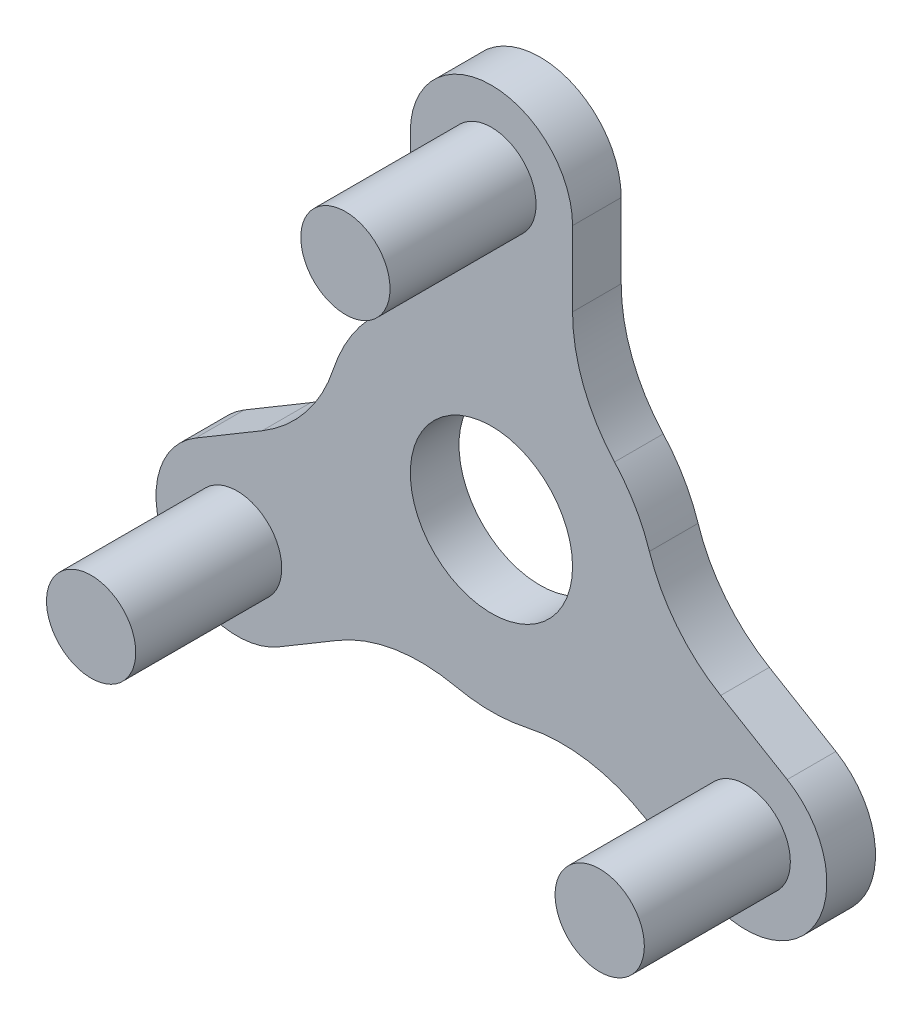
ISO-10303-21;
HEADER;
FILE_DESCRIPTION(('STEP AP214'),'2;1');
FILE_NAME('part.step','',(''),(''),'','','');
FILE_SCHEMA(('AUTOMOTIVE_DESIGN { 1 0 10303 214 1 1 1 1 }'));
ENDSEC;
DATA;
#1=APPLICATION_CONTEXT('core data for automotive mechanical design processes');
#2=APPLICATION_PROTOCOL_DEFINITION('international standard','automotive_design',2000,#1);
#3=PRODUCT_CONTEXT('',#1,'mechanical');
#4=PRODUCT('Part','Part','',(#3));
#5=PRODUCT_RELATED_PRODUCT_CATEGORY('part','',(#4));
#6=PRODUCT_DEFINITION_FORMATION('','',#4);
#7=PRODUCT_DEFINITION_CONTEXT('part definition',#1,'design');
#8=PRODUCT_DEFINITION('design','',#6,#7);
#9=PRODUCT_DEFINITION_SHAPE('','',#8);
#10=(LENGTH_UNIT() NAMED_UNIT(*) SI_UNIT(.MILLI.,.METRE.));
#11=(NAMED_UNIT(*) PLANE_ANGLE_UNIT() SI_UNIT($,.RADIAN.));
#12=(NAMED_UNIT(*) SI_UNIT($,.STERADIAN.) SOLID_ANGLE_UNIT());
#13=UNCERTAINTY_MEASURE_WITH_UNIT(LENGTH_MEASURE(1.E-05),#10,'distance_accuracy_value','');
#14=(GEOMETRIC_REPRESENTATION_CONTEXT(3) GLOBAL_UNCERTAINTY_ASSIGNED_CONTEXT((#13)) GLOBAL_UNIT_ASSIGNED_CONTEXT((#10,
#11,#12)) REPRESENTATION_CONTEXT('',''));
#15=CARTESIAN_POINT('',(0.,0.,0.));
#16=DIRECTION('',(0.,0.,1.));
#17=DIRECTION('',(1.,0.,0.));
#18=AXIS2_PLACEMENT_3D('',#15,#16,#17);
#19=CARTESIAN_POINT('',(-15.6750598084983,-9.05000000000008,3.));
#20=DIRECTION('',(0.,0.,-1.));
#21=DIRECTION('',(-1.,0.,0.));
#22=AXIS2_PLACEMENT_3D('',#19,#20,#21);
#23=CYLINDRICAL_SURFACE('',#22,5.);
#24=CARTESIAN_POINT('',(-15.6750598084983,-9.05000000000008,0.));
#25=DIRECTION('',(0.,0.,1.));
#26=DIRECTION('',(1.,0.,0.));
#27=AXIS2_PLACEMENT_3D('',#24,#25,#26);
#28=CIRCLE('',#27,5.);
#29=CARTESIAN_POINT('',(-18.2317713929619,-4.75311439832654,0.));
#30=VERTEX_POINT('',#29);
#31=CARTESIAN_POINT('',(-13.1183482240346,-13.3468856016736,0.));
#32=VERTEX_POINT('',#31);
#33=EDGE_CURVE('E254',#30,#32,#28,.T.);
#34=ORIENTED_EDGE('',*,*,#33,.T.);
#35=DIRECTION('',(0.,0.,-1.));
#36=VECTOR('',#35,1.);
#37=CARTESIAN_POINT('',(-13.1183482240346,-13.3468856016736,3.));
#38=LINE('',#37,#36);
#39=CARTESIAN_POINT('',(-13.1183482240346,-13.3468856016736,3.));
#40=VERTEX_POINT('',#39);
#41=EDGE_CURVE('E210',#40,#32,#38,.T.);
#42=ORIENTED_EDGE('',*,*,#41,.F.);
#43=CARTESIAN_POINT('',(-15.6750598084983,-9.05000000000008,3.));
#44=DIRECTION('',(0.,0.,1.));
#45=DIRECTION('',(1.,0.,0.));
#46=AXIS2_PLACEMENT_3D('',#43,#44,#45);
#47=CIRCLE('',#46,5.);
#48=CARTESIAN_POINT('',(-18.2317713929619,-4.75311439832654,3.));
#49=VERTEX_POINT('',#48);
#50=EDGE_CURVE('E213',#49,#40,#47,.T.);
#51=ORIENTED_EDGE('',*,*,#50,.F.);
#52=DIRECTION('',(0.,0.,-1.));
#53=VECTOR('',#52,1.);
#54=CARTESIAN_POINT('',(-18.2317713929619,-4.75311439832654,3.));
#55=LINE('',#54,#53);
#56=EDGE_CURVE('E198',#49,#30,#55,.T.);
#57=ORIENTED_EDGE('',*,*,#56,.T.);
#58=EDGE_LOOP('',(#34,#42,#51,#57));
#59=FACE_BOUND('',#58,.T.);
#60=ADVANCED_FACE('F73',(#59),#23,.T.);
#61=CARTESIAN_POINT('',(2.43503335375282,-4.09238954480285,3.));
#62=DIRECTION('',(-0.511342316892728,0.859377120334709,0.));
#63=DIRECTION('',(-0.859377120334709,-0.511342316892728,0.));
#64=AXIS2_PLACEMENT_3D('',#61,#62,#63);
#65=PLANE('',#64);
#66=DIRECTION('',(0.859377120334709,0.511342316892728,0.));
#67=VECTOR('',#66,1.);
#68=CARTESIAN_POINT('',(2.43503335375282,-4.09238954480285,0.));
#69=LINE('',#68,#67);
#70=CARTESIAN_POINT('',(-9.46922520496294,-11.1756025001734,0.));
#71=VERTEX_POINT('',#70);
#72=EDGE_CURVE('E257',#32,#71,#69,.T.);
#73=ORIENTED_EDGE('',*,*,#72,.T.);
#74=DIRECTION('',(0.,0.,1.));
#75=VECTOR('',#74,1.);
#76=CARTESIAN_POINT('',(-9.46922520496294,-11.1756025001734,3.));
#77=LINE('',#76,#75);
#78=CARTESIAN_POINT('',(-9.46922520496294,-11.1756025001734,3.));
#79=VERTEX_POINT('',#78);
#80=EDGE_CURVE('E88',#71,#79,#77,.T.);
#81=ORIENTED_EDGE('',*,*,#80,.T.);
#82=DIRECTION('',(0.859377120334709,0.511342316892728,0.));
#83=VECTOR('',#82,1.);
#84=CARTESIAN_POINT('',(2.43503335375282,-4.09238954480285,3.));
#85=LINE('',#84,#83);
#86=EDGE_CURVE('E216',#40,#79,#85,.T.);
#87=ORIENTED_EDGE('',*,*,#86,.F.);
#88=ORIENTED_EDGE('',*,*,#41,.T.);
#89=EDGE_LOOP('',(#73,#81,#87,#88));
#90=FACE_BOUND('',#89,.T.);
#91=ADVANCED_FACE('F352',(#90),#65,.F.);
#92=CARTESIAN_POINT('',(0.,0.,3.));
#93=DIRECTION('',(0.,0.,-1.));
#94=DIRECTION('',(-1.,0.,0.));
#95=AXIS2_PLACEMENT_3D('',#92,#93,#94);
#96=CYLINDRICAL_SURFACE('',#95,10.2435458358109);
#97=CARTESIAN_POINT('',(0.,0.,0.));
#98=DIRECTION('',(0.,0.,1.));
#99=DIRECTION('',(1.,0.,0.));
#100=AXIS2_PLACEMENT_3D('',#97,#98,#99);
#101=CIRCLE('',#100,10.2435458358109);
#102=CARTESIAN_POINT('',(-2.20410288640831,-10.0036074371442,0.));
#103=VERTEX_POINT('',#102);
#104=CARTESIAN_POINT('',(2.20410288640832,-10.0036074371442,0.));
#105=VERTEX_POINT('',#104);
#106=EDGE_CURVE('E228',#103,#105,#101,.T.);
#107=ORIENTED_EDGE('',*,*,#106,.T.);
#108=DIRECTION('',(0.,0.,-1.));
#109=VECTOR('',#108,1.);
#110=CARTESIAN_POINT('',(2.20410288640832,-10.0036074371442,3.));
#111=LINE('',#110,#109);
#112=CARTESIAN_POINT('',(2.20410288640832,-10.0036074371442,3.));
#113=VERTEX_POINT('',#112);
#114=EDGE_CURVE('E291',#105,#113,#111,.F.);
#115=ORIENTED_EDGE('',*,*,#114,.T.);
#116=CARTESIAN_POINT('',(0.,0.,3.));
#117=DIRECTION('',(0.,0.,1.));
#118=DIRECTION('',(1.,0.,0.));
#119=AXIS2_PLACEMENT_3D('',#116,#117,#118);
#120=CIRCLE('',#119,10.2435458358109);
#121=CARTESIAN_POINT('',(-2.20410288640831,-10.0036074371442,3.));
#122=VERTEX_POINT('',#121);
#123=EDGE_CURVE('E234',#122,#113,#120,.T.);
#124=ORIENTED_EDGE('',*,*,#123,.F.);
#125=DIRECTION('',(0.,0.,-1.));
#126=VECTOR('',#125,1.);
#127=CARTESIAN_POINT('',(-2.20410288640831,-10.0036074371442,3.));
#128=LINE('',#127,#126);
#129=EDGE_CURVE('E288',#122,#103,#128,.T.);
#130=ORIENTED_EDGE('',*,*,#129,.T.);
#131=EDGE_LOOP('',(#107,#115,#124,#130));
#132=FACE_BOUND('',#131,.T.);
#133=ADVANCED_FACE('F357',(#132),#96,.T.);
#134=CARTESIAN_POINT('',(-2.43503335375282,-4.09238954480286,3.));
#135=DIRECTION('',(-0.511342316892728,-0.859377120334709,0.));
#136=DIRECTION('',(0.859377120334709,-0.511342316892728,0.));
#137=AXIS2_PLACEMENT_3D('',#134,#135,#136);
#138=PLANE('',#137);
#139=DIRECTION('',(-0.859377120334709,0.511342316892728,0.));
#140=VECTOR('',#139,1.);
#141=CARTESIAN_POINT('',(-2.43503335375282,-4.09238954480286,3.));
#142=LINE('',#141,#140);
#143=CARTESIAN_POINT('',(13.1183482240346,-13.3468856016736,3.));
#144=VERTEX_POINT('',#143);
#145=CARTESIAN_POINT('',(9.46922520496294,-11.1756025001734,3.));
#146=VERTEX_POINT('',#145);
#147=EDGE_CURVE('E240',#144,#146,#142,.T.);
#148=ORIENTED_EDGE('',*,*,#147,.T.);
#149=DIRECTION('',(0.,0.,-1.));
#150=VECTOR('',#149,1.);
#151=CARTESIAN_POINT('',(9.46922520496294,-11.1756025001734,3.));
#152=LINE('',#151,#150);
#153=CARTESIAN_POINT('',(9.46922520496294,-11.1756025001734,0.));
#154=VERTEX_POINT('',#153);
#155=EDGE_CURVE('E209',#146,#154,#152,.T.);
#156=ORIENTED_EDGE('',*,*,#155,.T.);
#157=DIRECTION('',(-0.859377120334709,0.511342316892728,0.));
#158=VECTOR('',#157,1.);
#159=CARTESIAN_POINT('',(-2.43503335375282,-4.09238954480286,0.));
#160=LINE('',#159,#158);
#161=CARTESIAN_POINT('',(13.1183482240346,-13.3468856016736,0.));
#162=VERTEX_POINT('',#161);
#163=EDGE_CURVE('E259',#162,#154,#160,.T.);
#164=ORIENTED_EDGE('',*,*,#163,.F.);
#165=DIRECTION('',(0.,0.,-1.));
#166=VECTOR('',#165,1.);
#167=CARTESIAN_POINT('',(13.1183482240346,-13.3468856016736,3.));
#168=LINE('',#167,#166);
#169=EDGE_CURVE('E278',#144,#162,#168,.T.);
#170=ORIENTED_EDGE('',*,*,#169,.F.);
#171=EDGE_LOOP('',(#148,#156,#164,#170));
#172=FACE_BOUND('',#171,.T.);
#173=ADVANCED_FACE('F415',(#172),#138,.T.);
#174=CARTESIAN_POINT('',(2.67838981517445,4.50138165854423,3.));
#175=DIRECTION('',(-0.511342316892728,-0.859377120334709,0.));
#176=DIRECTION('',(0.859377120334709,-0.511342316892728,0.));
#177=AXIS2_PLACEMENT_3D('',#174,#175,#176);
#178=PLANE('',#177);
#179=DIRECTION('',(-0.859377120334709,0.511342316892728,0.));
#180=VECTOR('',#179,1.);
#181=CARTESIAN_POINT('',(2.67838981517445,4.50138165854423,0.));
#182=LINE('',#181,#180);
#183=CARTESIAN_POINT('',(18.2317713929619,-4.75311439832654,0.));
#184=VERTEX_POINT('',#183);
#185=CARTESIAN_POINT('',(14.1312068435024,-2.31321679380084,0.));
#186=VERTEX_POINT('',#185);
#187=EDGE_CURVE('E262',#184,#186,#182,.T.);
#188=ORIENTED_EDGE('',*,*,#187,.T.);
#189=DIRECTION('',(0.,0.,1.));
#190=VECTOR('',#189,1.);
#191=CARTESIAN_POINT('',(14.1312068435024,-2.31321679380084,3.));
#192=LINE('',#191,#190);
#193=CARTESIAN_POINT('',(14.1312068435024,-2.31321679380084,3.));
#194=VERTEX_POINT('',#193);
#195=EDGE_CURVE('E298',#186,#194,#192,.T.);
#196=ORIENTED_EDGE('',*,*,#195,.T.);
#197=DIRECTION('',(-0.859377120334709,0.511342316892728,0.));
#198=VECTOR('',#197,1.);
#199=CARTESIAN_POINT('',(2.67838981517445,4.50138165854423,3.));
#200=LINE('',#199,#198);
#201=CARTESIAN_POINT('',(18.2317713929619,-4.75311439832654,3.));
#202=VERTEX_POINT('',#201);
#203=EDGE_CURVE('E243',#202,#194,#200,.T.);
#204=ORIENTED_EDGE('',*,*,#203,.F.);
#205=DIRECTION('',(0.,0.,-1.));
#206=VECTOR('',#205,1.);
#207=CARTESIAN_POINT('',(18.2317713929619,-4.75311439832654,3.));
#208=LINE('',#207,#206);
#209=EDGE_CURVE('E276',#202,#184,#208,.T.);
#210=ORIENTED_EDGE('',*,*,#209,.T.);
#211=EDGE_LOOP('',(#188,#196,#204,#210));
#212=FACE_BOUND('',#211,.T.);
#213=ADVANCED_FACE('F413',(#212),#178,.F.);
#214=CARTESIAN_POINT('',(9.73807905119151,3.17805721834967,3.));
#215=VERTEX_POINT('',#214);
#216=CARTESIAN_POINT('',(7.59023092018547,6.87885352864995,3.));
#217=VERTEX_POINT('',#216);
#218=EDGE_CURVE('E239',#215,#217,#120,.T.);
#219=ORIENTED_EDGE('',*,*,#218,.F.);
#220=DIRECTION('',(0.,0.,-1.));
#221=VECTOR('',#220,1.);
#222=CARTESIAN_POINT('',(9.73807905119151,3.17805721834967,3.));
#223=LINE('',#222,#221);
#224=CARTESIAN_POINT('',(9.73807905119151,3.17805721834967,0.));
#225=VERTEX_POINT('',#224);
#226=EDGE_CURVE('E295',#215,#225,#223,.T.);
#227=ORIENTED_EDGE('',*,*,#226,.T.);
#228=CARTESIAN_POINT('',(7.59023092018547,6.87885352864995,0.));
#229=VERTEX_POINT('',#228);
#230=EDGE_CURVE('E227',#225,#229,#101,.T.);
#231=ORIENTED_EDGE('',*,*,#230,.T.);
#232=DIRECTION('',(0.,0.,-1.));
#233=VECTOR('',#232,1.);
#234=CARTESIAN_POINT('',(7.59023092018547,6.87885352864995,3.));
#235=LINE('',#234,#233);
#236=EDGE_CURVE('E293',#229,#217,#235,.F.);
#237=ORIENTED_EDGE('',*,*,#236,.T.);
#238=EDGE_LOOP('',(#219,#227,#231,#237));
#239=FACE_BOUND('',#238,.T.);
#240=ADVANCED_FACE('F407',(#239),#96,.T.);
#241=CARTESIAN_POINT('',(5.,0.,3.));
#242=DIRECTION('',(1.,0.,0.));
#243=DIRECTION('',(0.,1.,0.));
#244=AXIS2_PLACEMENT_3D('',#241,#242,#243);
#245=PLANE('',#244);
#246=DIRECTION('',(0.,-1.,0.));
#247=VECTOR('',#246,1.);
#248=CARTESIAN_POINT('',(5.,0.,3.));
#249=LINE('',#248,#247);
#250=CARTESIAN_POINT('',(5.,18.2,3.));
#251=VERTEX_POINT('',#250);
#252=CARTESIAN_POINT('',(5.,13.5941585986989,3.));
#253=VERTEX_POINT('',#252);
#254=EDGE_CURVE('E246',#251,#253,#249,.T.);
#255=ORIENTED_EDGE('',*,*,#254,.T.);
#256=DIRECTION('',(0.,0.,-1.));
#257=VECTOR('',#256,1.);
#258=CARTESIAN_POINT('',(5.,13.5941585986989,3.));
#259=LINE('',#258,#257);
#260=CARTESIAN_POINT('',(5.,13.5941585986989,0.));
#261=VERTEX_POINT('',#260);
#262=EDGE_CURVE('E300',#253,#261,#259,.T.);
#263=ORIENTED_EDGE('',*,*,#262,.T.);
#264=DIRECTION('',(0.,-1.,0.));
#265=VECTOR('',#264,1.);
#266=CARTESIAN_POINT('',(5.,0.,0.));
#267=LINE('',#266,#265);
#268=CARTESIAN_POINT('',(5.,18.2,0.));
#269=VERTEX_POINT('',#268);
#270=EDGE_CURVE('E265',#269,#261,#267,.T.);
#271=ORIENTED_EDGE('',*,*,#270,.F.);
#272=DIRECTION('',(0.,0.,-1.));
#273=VECTOR('',#272,1.);
#274=CARTESIAN_POINT('',(5.,18.2,3.));
#275=LINE('',#274,#273);
#276=EDGE_CURVE('E274',#251,#269,#275,.T.);
#277=ORIENTED_EDGE('',*,*,#276,.F.);
#278=EDGE_LOOP('',(#255,#263,#271,#277));
#279=FACE_BOUND('',#278,.T.);
#280=ADVANCED_FACE('F387',(#279),#245,.T.);
#281=CARTESIAN_POINT('',(0.,18.2,3.));
#282=DIRECTION('',(0.,0.,-1.));
#283=DIRECTION('',(-1.,0.,0.));
#284=AXIS2_PLACEMENT_3D('',#281,#282,#283);
#285=CYLINDRICAL_SURFACE('',#284,5.);
#286=CARTESIAN_POINT('',(0.,18.2,0.));
#287=DIRECTION('',(0.,0.,1.));
#288=DIRECTION('',(1.,0.,0.));
#289=AXIS2_PLACEMENT_3D('',#286,#287,#288);
#290=CIRCLE('',#289,5.);
#291=CARTESIAN_POINT('',(-5.,18.2,0.));
#292=VERTEX_POINT('',#291);
#293=EDGE_CURVE('E268',#269,#292,#290,.T.);
#294=ORIENTED_EDGE('',*,*,#293,.T.);
#295=DIRECTION('',(0.,0.,-1.));
#296=VECTOR('',#295,1.);
#297=CARTESIAN_POINT('',(-5.,18.2,3.));
#298=LINE('',#297,#296);
#299=CARTESIAN_POINT('',(-5.,18.2,3.));
#300=VERTEX_POINT('',#299);
#301=EDGE_CURVE('E237',#300,#292,#298,.T.);
#302=ORIENTED_EDGE('',*,*,#301,.F.);
#303=CARTESIAN_POINT('',(0.,18.2,3.));
#304=DIRECTION('',(0.,0.,1.));
#305=DIRECTION('',(1.,0.,0.));
#306=AXIS2_PLACEMENT_3D('',#303,#304,#305);
#307=CIRCLE('',#306,5.);
#308=EDGE_CURVE('E249',#251,#300,#307,.T.);
#309=ORIENTED_EDGE('',*,*,#308,.F.);
#310=ORIENTED_EDGE('',*,*,#276,.T.);
#311=EDGE_LOOP('',(#294,#302,#309,#310));
#312=FACE_BOUND('',#311,.T.);
#313=ADVANCED_FACE('F393',(#312),#285,.T.);
#314=CARTESIAN_POINT('',(-5.,0.,3.));
#315=DIRECTION('',(1.,0.,0.));
#316=DIRECTION('',(0.,1.,0.));
#317=AXIS2_PLACEMENT_3D('',#314,#315,#316);
#318=PLANE('',#317);
#319=DIRECTION('',(0.,-1.,0.));
#320=VECTOR('',#319,1.);
#321=CARTESIAN_POINT('',(-5.,0.,0.));
#322=LINE('',#321,#320);
#323=CARTESIAN_POINT('',(-5.,13.5941585986989,0.));
#324=VERTEX_POINT('',#323);
#325=EDGE_CURVE('E225',#292,#324,#322,.T.);
#326=ORIENTED_EDGE('',*,*,#325,.T.);
#327=DIRECTION('',(0.,0.,1.));
#328=VECTOR('',#327,1.);
#329=CARTESIAN_POINT('',(-5.,13.5941585986989,3.));
#330=LINE('',#329,#328);
#331=CARTESIAN_POINT('',(-5.,13.5941585986989,3.));
#332=VERTEX_POINT('',#331);
#333=EDGE_CURVE('E308',#324,#332,#330,.T.);
#334=ORIENTED_EDGE('',*,*,#333,.T.);
#335=DIRECTION('',(0.,-1.,0.));
#336=VECTOR('',#335,1.);
#337=CARTESIAN_POINT('',(-5.,0.,3.));
#338=LINE('',#337,#336);
#339=EDGE_CURVE('E238',#300,#332,#338,.T.);
#340=ORIENTED_EDGE('',*,*,#339,.F.);
#341=ORIENTED_EDGE('',*,*,#301,.T.);
#342=EDGE_LOOP('',(#326,#334,#340,#341));
#343=FACE_BOUND('',#342,.T.);
#344=ADVANCED_FACE('F399',(#343),#318,.F.);
#345=CARTESIAN_POINT('',(-7.59023092018547,6.87885352864995,3.));
#346=VERTEX_POINT('',#345);
#347=CARTESIAN_POINT('',(-9.73807905119151,3.17805721834968,3.));
#348=VERTEX_POINT('',#347);
#349=EDGE_CURVE('E235',#346,#348,#120,.T.);
#350=ORIENTED_EDGE('',*,*,#349,.F.);
#351=DIRECTION('',(0.,0.,-1.));
#352=VECTOR('',#351,1.);
#353=CARTESIAN_POINT('',(-7.59023092018547,6.87885352864995,3.));
#354=LINE('',#353,#352);
#355=CARTESIAN_POINT('',(-7.59023092018547,6.87885352864995,0.));
#356=VERTEX_POINT('',#355);
#357=EDGE_CURVE('E305',#346,#356,#354,.T.);
#358=ORIENTED_EDGE('',*,*,#357,.T.);
#359=CARTESIAN_POINT('',(-9.73807905119151,3.17805721834968,0.));
#360=VERTEX_POINT('',#359);
#361=EDGE_CURVE('E222',#356,#360,#101,.T.);
#362=ORIENTED_EDGE('',*,*,#361,.T.);
#363=DIRECTION('',(0.,0.,-1.));
#364=VECTOR('',#363,1.);
#365=CARTESIAN_POINT('',(-9.73807905119151,3.17805721834968,3.));
#366=LINE('',#365,#364);
#367=EDGE_CURVE('E303',#360,#348,#366,.F.);
#368=ORIENTED_EDGE('',*,*,#367,.T.);
#369=EDGE_LOOP('',(#350,#358,#362,#368));
#370=FACE_BOUND('',#369,.T.);
#371=ADVANCED_FACE('F337',(#370),#96,.T.);
#372=CARTESIAN_POINT('',(-2.67838981517446,4.50138165854424,3.));
#373=DIRECTION('',(-0.511342316892728,0.859377120334709,0.));
#374=DIRECTION('',(-0.859377120334709,-0.511342316892728,0.));
#375=AXIS2_PLACEMENT_3D('',#372,#373,#374);
#376=PLANE('',#375);
#377=DIRECTION('',(0.859377120334709,0.511342316892728,0.));
#378=VECTOR('',#377,1.);
#379=CARTESIAN_POINT('',(-2.67838981517446,4.50138165854424,3.));
#380=LINE('',#379,#378);
#381=CARTESIAN_POINT('',(-14.1312068435023,-2.31321679380083,3.));
#382=VERTEX_POINT('',#381);
#383=EDGE_CURVE('E203',#49,#382,#380,.T.);
#384=ORIENTED_EDGE('',*,*,#383,.T.);
#385=DIRECTION('',(0.,0.,-1.));
#386=VECTOR('',#385,1.);
#387=CARTESIAN_POINT('',(-14.1312068435023,-2.31321679380083,3.));
#388=LINE('',#387,#386);
#389=CARTESIAN_POINT('',(-14.1312068435023,-2.31321679380083,0.));
#390=VERTEX_POINT('',#389);
#391=EDGE_CURVE('E310',#382,#390,#388,.T.);
#392=ORIENTED_EDGE('',*,*,#391,.T.);
#393=DIRECTION('',(0.859377120334709,0.511342316892728,0.));
#394=VECTOR('',#393,1.);
#395=CARTESIAN_POINT('',(-2.67838981517446,4.50138165854424,0.));
#396=LINE('',#395,#394);
#397=EDGE_CURVE('E206',#30,#390,#396,.T.);
#398=ORIENTED_EDGE('',*,*,#397,.F.);
#399=ORIENTED_EDGE('',*,*,#56,.F.);
#400=EDGE_LOOP('',(#384,#392,#398,#399));
#401=FACE_BOUND('',#400,.T.);
#402=ADVANCED_FACE('F200',(#401),#376,.T.);
#403=CARTESIAN_POINT('',(0.,0.,0.));
#404=DIRECTION('',(0.,0.,1.));
#405=DIRECTION('',(1.,0.,0.));
#406=AXIS2_PLACEMENT_3D('',#403,#404,#405);
#407=PLANE('',#406);
#408=CARTESIAN_POINT('',(0.,0.,0.));
#409=DIRECTION('',(0.,0.,1.));
#410=DIRECTION('',(1.,0.,0.));
#411=AXIS2_PLACEMENT_3D('',#408,#409,#410);
#412=CIRCLE('',#411,5.);
#413=CARTESIAN_POINT('',(5.,0.,0.));
#414=VERTEX_POINT('',#413);
#415=EDGE_CURVE('E230',#414,#414,#412,.T.);
#416=ORIENTED_EDGE('',*,*,#415,.T.);
#417=EDGE_LOOP('',(#416));
#418=FACE_BOUND('',#417,.T.);
#419=ORIENTED_EDGE('',*,*,#397,.T.);
#420=CARTESIAN_POINT('',(-19.2446300124296,6.28055440954626,0.));
#421=DIRECTION('',(0.,0.,1.));
#422=DIRECTION('',(1.,0.,0.));
#423=AXIS2_PLACEMENT_3D('',#420,#421,#422);
#424=CIRCLE('',#423,10.);
#425=EDGE_CURVE('E329',#390,#360,#424,.T.);
#426=ORIENTED_EDGE('',*,*,#425,.T.);
#427=ORIENTED_EDGE('',*,*,#361,.F.);
#428=CARTESIAN_POINT('',(-15.,13.5941585986989,0.));
#429=DIRECTION('',(0.,0.,1.));
#430=DIRECTION('',(1.,0.,0.));
#431=AXIS2_PLACEMENT_3D('',#428,#429,#430);
#432=CIRCLE('',#431,10.);
#433=EDGE_CURVE('E325',#356,#324,#432,.T.);
#434=ORIENTED_EDGE('',*,*,#433,.T.);
#435=ORIENTED_EDGE('',*,*,#325,.F.);
#436=ORIENTED_EDGE('',*,*,#293,.F.);
#437=ORIENTED_EDGE('',*,*,#270,.T.);
#438=CARTESIAN_POINT('',(15.,13.5941585986989,0.));
#439=DIRECTION('',(0.,0.,1.));
#440=DIRECTION('',(1.,0.,0.));
#441=AXIS2_PLACEMENT_3D('',#438,#439,#440);
#442=CIRCLE('',#441,10.);
#443=EDGE_CURVE('E321',#261,#229,#442,.T.);
#444=ORIENTED_EDGE('',*,*,#443,.T.);
#445=ORIENTED_EDGE('',*,*,#230,.F.);
#446=CARTESIAN_POINT('',(19.2446300124296,6.28055440954625,0.));
#447=DIRECTION('',(0.,0.,1.));
#448=DIRECTION('',(1.,0.,0.));
#449=AXIS2_PLACEMENT_3D('',#446,#447,#448);
#450=CIRCLE('',#449,10.);
#451=EDGE_CURVE('E317',#225,#186,#450,.T.);
#452=ORIENTED_EDGE('',*,*,#451,.T.);
#453=ORIENTED_EDGE('',*,*,#187,.F.);
#454=CARTESIAN_POINT('',(15.6750598084983,-9.05000000000008,0.));
#455=DIRECTION('',(0.,0.,1.));
#456=DIRECTION('',(1.,0.,0.));
#457=AXIS2_PLACEMENT_3D('',#454,#455,#456);
#458=CIRCLE('',#457,5.);
#459=EDGE_CURVE('E283',#162,#184,#458,.T.);
#460=ORIENTED_EDGE('',*,*,#459,.F.);
#461=ORIENTED_EDGE('',*,*,#163,.T.);
#462=CARTESIAN_POINT('',(4.35580203603567,-19.7693737035204,0.));
#463=DIRECTION('',(0.,0.,1.));
#464=DIRECTION('',(1.,0.,0.));
#465=AXIS2_PLACEMENT_3D('',#462,#463,#464);
#466=CIRCLE('',#465,10.);
#467=EDGE_CURVE('E313',#154,#105,#466,.T.);
#468=ORIENTED_EDGE('',*,*,#467,.T.);
#469=ORIENTED_EDGE('',*,*,#106,.F.);
#470=CARTESIAN_POINT('',(-4.35580203603566,-19.7693737035204,0.));
#471=DIRECTION('',(0.,0.,1.));
#472=DIRECTION('',(1.,0.,0.));
#473=AXIS2_PLACEMENT_3D('',#470,#471,#472);
#474=CIRCLE('',#473,10.);
#475=EDGE_CURVE('E81',#103,#71,#474,.T.);
#476=ORIENTED_EDGE('',*,*,#475,.T.);
#477=ORIENTED_EDGE('',*,*,#72,.F.);
#478=ORIENTED_EDGE('',*,*,#33,.F.);
#479=EDGE_LOOP('',(#419,#426,#427,#434,#435,#436,#437,#444,#445,#452,#453,#460,#461,#468,#469,
#476,#477,#478));
#480=FACE_BOUND('',#479,.T.);
#481=ADVANCED_FACE('F332',(#418,#480),#407,.F.);
#482=CARTESIAN_POINT('',(0.,0.,3.));
#483=DIRECTION('',(0.,0.,1.));
#484=DIRECTION('',(1.,0.,0.));
#485=AXIS2_PLACEMENT_3D('',#482,#483,#484);
#486=PLANE('',#485);
#487=CARTESIAN_POINT('',(-15.6750598084983,-9.05000000000008,3.));
#488=DIRECTION('',(0.,0.,1.));
#489=DIRECTION('',(1.,0.,0.));
#490=AXIS2_PLACEMENT_3D('',#487,#488,#489);
#491=CIRCLE('',#490,2.75);
#492=CARTESIAN_POINT('',(-12.9250598084983,-9.05000000000008,3.));
#493=VERTEX_POINT('',#492);
#494=EDGE_CURVE('E628',#493,#493,#491,.T.);
#495=ORIENTED_EDGE('',*,*,#494,.F.);
#496=EDGE_LOOP('',(#495));
#497=FACE_BOUND('',#496,.T.);
#498=CARTESIAN_POINT('',(15.6750598084983,-9.05000000000008,3.));
#499=DIRECTION('',(0.,0.,1.));
#500=DIRECTION('',(1.,0.,0.));
#501=AXIS2_PLACEMENT_3D('',#498,#499,#500);
#502=CIRCLE('',#501,2.75);
#503=CARTESIAN_POINT('',(18.4250598084983,-9.05000000000008,3.));
#504=VERTEX_POINT('',#503);
#505=EDGE_CURVE('E622',#504,#504,#502,.T.);
#506=ORIENTED_EDGE('',*,*,#505,.F.);
#507=EDGE_LOOP('',(#506));
#508=FACE_BOUND('',#507,.T.);
#509=CARTESIAN_POINT('',(0.,18.2,3.));
#510=DIRECTION('',(0.,0.,1.));
#511=DIRECTION('',(1.,0.,0.));
#512=AXIS2_PLACEMENT_3D('',#509,#510,#511);
#513=CIRCLE('',#512,2.75);
#514=CARTESIAN_POINT('',(2.75,18.2,3.));
#515=VERTEX_POINT('',#514);
#516=EDGE_CURVE('E616',#515,#515,#513,.T.);
#517=ORIENTED_EDGE('',*,*,#516,.F.);
#518=EDGE_LOOP('',(#517));
#519=FACE_BOUND('',#518,.T.);
#520=CARTESIAN_POINT('',(0.,0.,3.));
#521=DIRECTION('',(0.,0.,1.));
#522=DIRECTION('',(1.,0.,0.));
#523=AXIS2_PLACEMENT_3D('',#520,#521,#522);
#524=CIRCLE('',#523,5.);
#525=CARTESIAN_POINT('',(5.,0.,3.));
#526=VERTEX_POINT('',#525);
#527=EDGE_CURVE('E611',#526,#526,#524,.T.);
#528=ORIENTED_EDGE('',*,*,#527,.F.);
#529=EDGE_LOOP('',(#528));
#530=FACE_BOUND('',#529,.T.);
#531=ORIENTED_EDGE('',*,*,#383,.F.);
#532=ORIENTED_EDGE('',*,*,#50,.T.);
#533=ORIENTED_EDGE('',*,*,#86,.T.);
#534=CARTESIAN_POINT('',(-4.35580203603566,-19.7693737035204,3.));
#535=DIRECTION('',(0.,0.,1.));
#536=DIRECTION('',(1.,0.,0.));
#537=AXIS2_PLACEMENT_3D('',#534,#535,#536);
#538=CIRCLE('',#537,10.);
#539=EDGE_CURVE('E12',#79,#122,#538,.F.);
#540=ORIENTED_EDGE('',*,*,#539,.T.);
#541=ORIENTED_EDGE('',*,*,#123,.T.);
#542=CARTESIAN_POINT('',(4.35580203603567,-19.7693737035204,3.));
#543=DIRECTION('',(0.,0.,1.));
#544=DIRECTION('',(1.,0.,0.));
#545=AXIS2_PLACEMENT_3D('',#542,#543,#544);
#546=CIRCLE('',#545,10.);
#547=EDGE_CURVE('E315',#113,#146,#546,.F.);
#548=ORIENTED_EDGE('',*,*,#547,.T.);
#549=ORIENTED_EDGE('',*,*,#147,.F.);
#550=CARTESIAN_POINT('',(15.6750598084983,-9.05000000000008,3.));
#551=DIRECTION('',(0.,0.,1.));
#552=DIRECTION('',(1.,0.,0.));
#553=AXIS2_PLACEMENT_3D('',#550,#551,#552);
#554=CIRCLE('',#553,5.);
#555=EDGE_CURVE('E255',#144,#202,#554,.T.);
#556=ORIENTED_EDGE('',*,*,#555,.T.);
#557=ORIENTED_EDGE('',*,*,#203,.T.);
#558=CARTESIAN_POINT('',(19.2446300124296,6.28055440954625,3.));
#559=DIRECTION('',(0.,0.,1.));
#560=DIRECTION('',(1.,0.,0.));
#561=AXIS2_PLACEMENT_3D('',#558,#559,#560);
#562=CIRCLE('',#561,10.);
#563=EDGE_CURVE('E319',#194,#215,#562,.F.);
#564=ORIENTED_EDGE('',*,*,#563,.T.);
#565=ORIENTED_EDGE('',*,*,#218,.T.);
#566=CARTESIAN_POINT('',(15.,13.5941585986989,3.));
#567=DIRECTION('',(0.,0.,1.));
#568=DIRECTION('',(1.,0.,0.));
#569=AXIS2_PLACEMENT_3D('',#566,#567,#568);
#570=CIRCLE('',#569,10.);
#571=EDGE_CURVE('E323',#217,#253,#570,.F.);
#572=ORIENTED_EDGE('',*,*,#571,.T.);
#573=ORIENTED_EDGE('',*,*,#254,.F.);
#574=ORIENTED_EDGE('',*,*,#308,.T.);
#575=ORIENTED_EDGE('',*,*,#339,.T.);
#576=CARTESIAN_POINT('',(-15.,13.5941585986989,3.));
#577=DIRECTION('',(0.,0.,1.));
#578=DIRECTION('',(1.,0.,0.));
#579=AXIS2_PLACEMENT_3D('',#576,#577,#578);
#580=CIRCLE('',#579,10.);
#581=EDGE_CURVE('E327',#332,#346,#580,.F.);
#582=ORIENTED_EDGE('',*,*,#581,.T.);
#583=ORIENTED_EDGE('',*,*,#349,.T.);
#584=CARTESIAN_POINT('',(-19.2446300124296,6.28055440954626,3.));
#585=DIRECTION('',(0.,0.,1.));
#586=DIRECTION('',(1.,0.,0.));
#587=AXIS2_PLACEMENT_3D('',#584,#585,#586);
#588=CIRCLE('',#587,10.);
#589=EDGE_CURVE('E221',#348,#382,#588,.F.);
#590=ORIENTED_EDGE('',*,*,#589,.T.);
#591=EDGE_LOOP('',(#531,#532,#533,#540,#541,#548,#549,#556,#557,#564,#565,#572,#573,#574,#575,
#582,#583,#590));
#592=FACE_BOUND('',#591,.T.);
#593=ADVANCED_FACE('F218',(#497,#508,#519,#530,#592),#486,.T.);
#594=CARTESIAN_POINT('',(15.6750598084983,-9.05000000000008,3.));
#595=DIRECTION('',(0.,0.,-1.));
#596=DIRECTION('',(-1.,0.,0.));
#597=AXIS2_PLACEMENT_3D('',#594,#595,#596);
#598=CYLINDRICAL_SURFACE('',#597,5.);
#599=ORIENTED_EDGE('',*,*,#169,.T.);
#600=ORIENTED_EDGE('',*,*,#459,.T.);
#601=ORIENTED_EDGE('',*,*,#209,.F.);
#602=ORIENTED_EDGE('',*,*,#555,.F.);
#603=EDGE_LOOP('',(#599,#600,#601,#602));
#604=FACE_BOUND('',#603,.T.);
#605=ADVANCED_FACE('F363',(#604),#598,.T.);
#606=CARTESIAN_POINT('',(0.,0.,-7.));
#607=DIRECTION('',(0.,0.,1.));
#608=DIRECTION('',(1.,0.,0.));
#609=AXIS2_PLACEMENT_3D('',#606,#607,#608);
#610=CYLINDRICAL_SURFACE('',#609,5.);
#611=ORIENTED_EDGE('',*,*,#527,.T.);
#612=EDGE_LOOP('',(#611));
#613=FACE_BOUND('',#612,.T.);
#614=ORIENTED_EDGE('',*,*,#415,.F.);
#615=EDGE_LOOP('',(#614));
#616=FACE_BOUND('',#615,.T.);
#617=ADVANCED_FACE('F366',(#613,#616),#610,.F.);
#618=CARTESIAN_POINT('',(4.35580203603567,-19.7693737035204,3.));
#619=DIRECTION('',(0.,0.,-1.));
#620=DIRECTION('',(-1.,0.,0.));
#621=AXIS2_PLACEMENT_3D('',#618,#619,#620);
#622=CYLINDRICAL_SURFACE('',#621,10.);
#623=ORIENTED_EDGE('',*,*,#547,.F.);
#624=ORIENTED_EDGE('',*,*,#114,.F.);
#625=ORIENTED_EDGE('',*,*,#467,.F.);
#626=ORIENTED_EDGE('',*,*,#155,.F.);
#627=EDGE_LOOP('',(#623,#624,#625,#626));
#628=FACE_BOUND('',#627,.T.);
#629=ADVANCED_FACE('F368',(#628),#622,.F.);
#630=CARTESIAN_POINT('',(19.2446300124296,6.28055440954625,3.));
#631=DIRECTION('',(0.,0.,-1.));
#632=DIRECTION('',(-1.,0.,0.));
#633=AXIS2_PLACEMENT_3D('',#630,#631,#632);
#634=CYLINDRICAL_SURFACE('',#633,10.);
#635=ORIENTED_EDGE('',*,*,#563,.F.);
#636=ORIENTED_EDGE('',*,*,#195,.F.);
#637=ORIENTED_EDGE('',*,*,#451,.F.);
#638=ORIENTED_EDGE('',*,*,#226,.F.);
#639=EDGE_LOOP('',(#635,#636,#637,#638));
#640=FACE_BOUND('',#639,.T.);
#641=ADVANCED_FACE('F371',(#640),#634,.F.);
#642=CARTESIAN_POINT('',(15.,13.5941585986989,3.));
#643=DIRECTION('',(0.,0.,-1.));
#644=DIRECTION('',(-1.,0.,0.));
#645=AXIS2_PLACEMENT_3D('',#642,#643,#644);
#646=CYLINDRICAL_SURFACE('',#645,10.);
#647=ORIENTED_EDGE('',*,*,#571,.F.);
#648=ORIENTED_EDGE('',*,*,#236,.F.);
#649=ORIENTED_EDGE('',*,*,#443,.F.);
#650=ORIENTED_EDGE('',*,*,#262,.F.);
#651=EDGE_LOOP('',(#647,#648,#649,#650));
#652=FACE_BOUND('',#651,.T.);
#653=ADVANCED_FACE('F348',(#652),#646,.F.);
#654=CARTESIAN_POINT('',(-15.,13.5941585986989,3.));
#655=DIRECTION('',(0.,0.,-1.));
#656=DIRECTION('',(-1.,0.,0.));
#657=AXIS2_PLACEMENT_3D('',#654,#655,#656);
#658=CYLINDRICAL_SURFACE('',#657,10.);
#659=ORIENTED_EDGE('',*,*,#581,.F.);
#660=ORIENTED_EDGE('',*,*,#333,.F.);
#661=ORIENTED_EDGE('',*,*,#433,.F.);
#662=ORIENTED_EDGE('',*,*,#357,.F.);
#663=EDGE_LOOP('',(#659,#660,#661,#662));
#664=FACE_BOUND('',#663,.T.);
#665=ADVANCED_FACE('F341',(#664),#658,.F.);
#666=CARTESIAN_POINT('',(-19.2446300124296,6.28055440954626,3.));
#667=DIRECTION('',(0.,0.,-1.));
#668=DIRECTION('',(-1.,0.,0.));
#669=AXIS2_PLACEMENT_3D('',#666,#667,#668);
#670=CYLINDRICAL_SURFACE('',#669,10.);
#671=ORIENTED_EDGE('',*,*,#589,.F.);
#672=ORIENTED_EDGE('',*,*,#367,.F.);
#673=ORIENTED_EDGE('',*,*,#425,.F.);
#674=ORIENTED_EDGE('',*,*,#391,.F.);
#675=EDGE_LOOP('',(#671,#672,#673,#674));
#676=FACE_BOUND('',#675,.T.);
#677=ADVANCED_FACE('F339',(#676),#670,.F.);
#678=CARTESIAN_POINT('',(-4.35580203603566,-19.7693737035204,3.));
#679=DIRECTION('',(0.,0.,-1.));
#680=DIRECTION('',(-1.,0.,0.));
#681=AXIS2_PLACEMENT_3D('',#678,#679,#680);
#682=CYLINDRICAL_SURFACE('',#681,10.);
#683=ORIENTED_EDGE('',*,*,#539,.F.);
#684=ORIENTED_EDGE('',*,*,#80,.F.);
#685=ORIENTED_EDGE('',*,*,#475,.F.);
#686=ORIENTED_EDGE('',*,*,#129,.F.);
#687=EDGE_LOOP('',(#683,#684,#685,#686));
#688=FACE_BOUND('',#687,.T.);
#689=ADVANCED_FACE('F75',(#688),#682,.F.);
#690=CARTESIAN_POINT('',(0.,18.2,12.));
#691=DIRECTION('',(0.,0.,-1.));
#692=DIRECTION('',(-1.,0.,0.));
#693=AXIS2_PLACEMENT_3D('',#690,#691,#692);
#694=CYLINDRICAL_SURFACE('',#693,2.75);
#695=CARTESIAN_POINT('',(0.,18.2,12.));
#696=DIRECTION('',(0.,0.,1.));
#697=DIRECTION('',(1.,0.,0.));
#698=AXIS2_PLACEMENT_3D('',#695,#696,#697);
#699=CIRCLE('',#698,2.75);
#700=CARTESIAN_POINT('',(2.75,18.2,12.));
#701=VERTEX_POINT('',#700);
#702=EDGE_CURVE('E613',#701,#701,#699,.T.);
#703=ORIENTED_EDGE('',*,*,#702,.F.);
#704=EDGE_LOOP('',(#703));
#705=FACE_BOUND('',#704,.T.);
#706=ORIENTED_EDGE('',*,*,#516,.T.);
#707=EDGE_LOOP('',(#706));
#708=FACE_BOUND('',#707,.T.);
#709=ADVANCED_FACE('F346',(#705,#708),#694,.T.);
#710=CARTESIAN_POINT('',(0.,18.2,12.));
#711=DIRECTION('',(0.,0.,1.));
#712=DIRECTION('',(1.,0.,0.));
#713=AXIS2_PLACEMENT_3D('',#710,#711,#712);
#714=PLANE('',#713);
#715=ORIENTED_EDGE('',*,*,#702,.T.);
#716=EDGE_LOOP('',(#715));
#717=FACE_BOUND('',#716,.T.);
#718=ADVANCED_FACE('F551',(#717),#714,.T.);
#719=CARTESIAN_POINT('',(15.6750598084983,-9.05000000000008,12.));
#720=DIRECTION('',(0.,0.,-1.));
#721=DIRECTION('',(-1.,0.,0.));
#722=AXIS2_PLACEMENT_3D('',#719,#720,#721);
#723=CYLINDRICAL_SURFACE('',#722,2.75);
#724=CARTESIAN_POINT('',(15.6750598084983,-9.05000000000008,12.));
#725=DIRECTION('',(0.,0.,1.));
#726=DIRECTION('',(1.,0.,0.));
#727=AXIS2_PLACEMENT_3D('',#724,#725,#726);
#728=CIRCLE('',#727,2.75);
#729=CARTESIAN_POINT('',(18.4250598084983,-9.05000000000008,12.));
#730=VERTEX_POINT('',#729);
#731=EDGE_CURVE('E620',#730,#730,#728,.T.);
#732=ORIENTED_EDGE('',*,*,#731,.F.);
#733=EDGE_LOOP('',(#732));
#734=FACE_BOUND('',#733,.T.);
#735=ORIENTED_EDGE('',*,*,#505,.T.);
#736=EDGE_LOOP('',(#735));
#737=FACE_BOUND('',#736,.T.);
#738=ADVANCED_FACE('F561',(#734,#737),#723,.T.);
#739=CARTESIAN_POINT('',(15.6750598084983,-9.05000000000008,12.));
#740=DIRECTION('',(0.,0.,1.));
#741=DIRECTION('',(1.,0.,0.));
#742=AXIS2_PLACEMENT_3D('',#739,#740,#741);
#743=PLANE('',#742);
#744=ORIENTED_EDGE('',*,*,#731,.T.);
#745=EDGE_LOOP('',(#744));
#746=FACE_BOUND('',#745,.T.);
#747=ADVANCED_FACE('F571',(#746),#743,.T.);
#748=CARTESIAN_POINT('',(-15.6750598084983,-9.05000000000008,12.));
#749=DIRECTION('',(0.,0.,-1.));
#750=DIRECTION('',(-1.,0.,0.));
#751=AXIS2_PLACEMENT_3D('',#748,#749,#750);
#752=CYLINDRICAL_SURFACE('',#751,2.75);
#753=CARTESIAN_POINT('',(-15.6750598084983,-9.05000000000008,12.));
#754=DIRECTION('',(0.,0.,1.));
#755=DIRECTION('',(1.,0.,0.));
#756=AXIS2_PLACEMENT_3D('',#753,#754,#755);
#757=CIRCLE('',#756,2.75);
#758=CARTESIAN_POINT('',(-12.9250598084983,-9.05000000000008,12.));
#759=VERTEX_POINT('',#758);
#760=EDGE_CURVE('E625',#759,#759,#757,.T.);
#761=ORIENTED_EDGE('',*,*,#760,.F.);
#762=EDGE_LOOP('',(#761));
#763=FACE_BOUND('',#762,.T.);
#764=ORIENTED_EDGE('',*,*,#494,.T.);
#765=EDGE_LOOP('',(#764));
#766=FACE_BOUND('',#765,.T.);
#767=ADVANCED_FACE('F581',(#763,#766),#752,.T.);
#768=CARTESIAN_POINT('',(-15.6750598084983,-9.05000000000008,12.));
#769=DIRECTION('',(0.,0.,1.));
#770=DIRECTION('',(1.,0.,0.));
#771=AXIS2_PLACEMENT_3D('',#768,#769,#770);
#772=PLANE('',#771);
#773=ORIENTED_EDGE('',*,*,#760,.T.);
#774=EDGE_LOOP('',(#773));
#775=FACE_BOUND('',#774,.T.);
#776=ADVANCED_FACE('F591',(#775),#772,.T.);
#777=CLOSED_SHELL('',(#60,#91,#133,#173,#213,#240,#280,#313,#344,#371,#402,#481,#593,#605,#617,
#629,#641,#653,#665,#677,#689,#709,#718,#738,#747,#767,#776));
#778=MANIFOLD_SOLID_BREP('B2',#777);
#779=ADVANCED_BREP_SHAPE_REPRESENTATION('',(#18,#778),#14);
#780=SHAPE_DEFINITION_REPRESENTATION(#9,#779);
ENDSEC;
END-ISO-10303-21;
